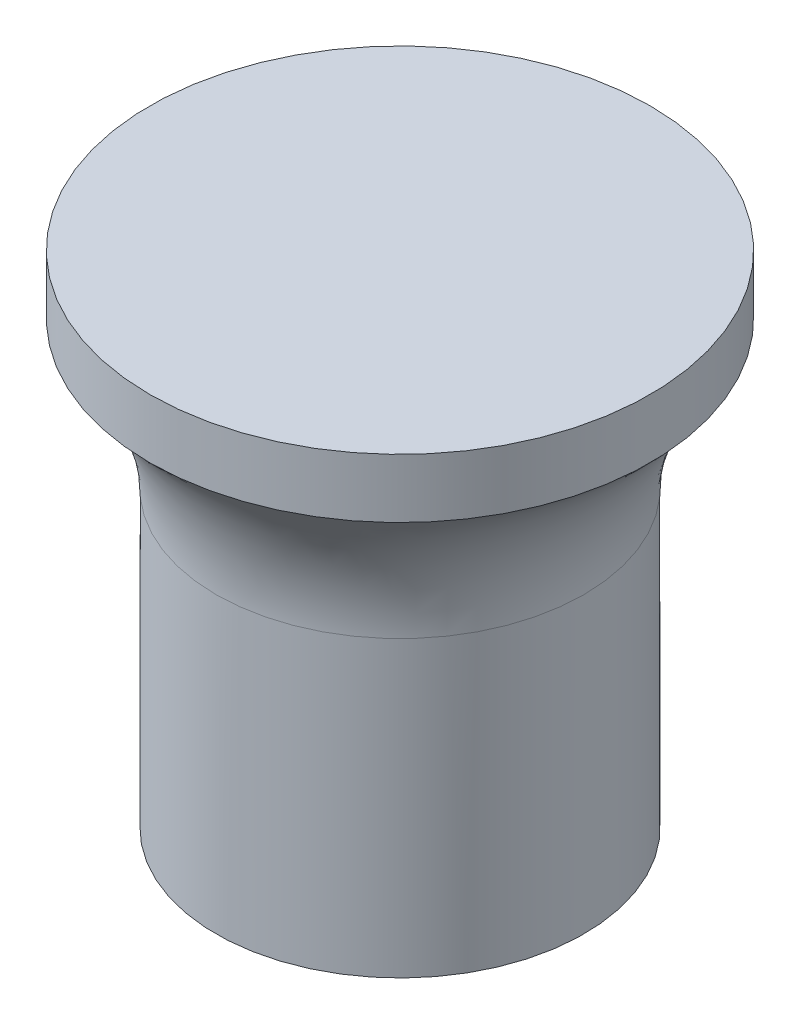
ISO-10303-21;
HEADER;
FILE_DESCRIPTION(('STEP AP214'),'2;1');
FILE_NAME('part.step','',(''),(''),'','','');
FILE_SCHEMA(('AUTOMOTIVE_DESIGN { 1 0 10303 214 1 1 1 1 }'));
ENDSEC;
DATA;
#1=APPLICATION_CONTEXT('core data for automotive mechanical design processes');
#2=APPLICATION_PROTOCOL_DEFINITION('international standard','automotive_design',2000,#1);
#3=PRODUCT_CONTEXT('',#1,'mechanical');
#4=PRODUCT('Part','Part','',(#3));
#5=PRODUCT_RELATED_PRODUCT_CATEGORY('part','',(#4));
#6=PRODUCT_DEFINITION_FORMATION('','',#4);
#7=PRODUCT_DEFINITION_CONTEXT('part definition',#1,'design');
#8=PRODUCT_DEFINITION('design','',#6,#7);
#9=PRODUCT_DEFINITION_SHAPE('','',#8);
#10=(LENGTH_UNIT() NAMED_UNIT(*) SI_UNIT(.MILLI.,.METRE.));
#11=(NAMED_UNIT(*) PLANE_ANGLE_UNIT() SI_UNIT($,.RADIAN.));
#12=(NAMED_UNIT(*) SI_UNIT($,.STERADIAN.) SOLID_ANGLE_UNIT());
#13=UNCERTAINTY_MEASURE_WITH_UNIT(LENGTH_MEASURE(1.E-05),#10,'distance_accuracy_value','');
#14=(GEOMETRIC_REPRESENTATION_CONTEXT(3) GLOBAL_UNCERTAINTY_ASSIGNED_CONTEXT((#13)) GLOBAL_UNIT_ASSIGNED_CONTEXT((#10,
#11,#12)) REPRESENTATION_CONTEXT('',''));
#15=CARTESIAN_POINT('',(0.,0.,0.));
#16=DIRECTION('',(0.,0.,1.));
#17=DIRECTION('',(1.,0.,0.));
#18=AXIS2_PLACEMENT_3D('',#15,#16,#17);
#19=CARTESIAN_POINT('',(0.,22.4,0.));
#20=DIRECTION('',(0.,1.,0.));
#21=DIRECTION('',(0.,0.,1.));
#22=AXIS2_PLACEMENT_3D('',#19,#20,#21);
#23=PLANE('',#22);
#24=CARTESIAN_POINT('',(0.,22.4,0.));
#25=DIRECTION('',(0.,1.,0.));
#26=DIRECTION('',(0.,0.,1.));
#27=AXIS2_PLACEMENT_3D('',#24,#25,#26);
#28=CIRCLE('',#27,6.34);
#29=CARTESIAN_POINT('',(0.,22.4,6.34));
#30=VERTEX_POINT('',#29);
#31=EDGE_CURVE('E48',#30,#30,#28,.F.);
#32=ORIENTED_EDGE('',*,*,#31,.T.);
#33=EDGE_LOOP('',(#32));
#34=FACE_BOUND('',#33,.T.);
#35=ADVANCED_FACE('F33',(#34),#23,.F.);
#36=CARTESIAN_POINT('',(0.,43.3322279708908,0.));
#37=DIRECTION('',(0.,-1.,0.));
#38=DIRECTION('',(0.,0.,-1.));
#39=AXIS2_PLACEMENT_3D('',#36,#37,#38);
#40=CYLINDRICAL_SURFACE('',#39,6.34);
#41=CARTESIAN_POINT('',(0.,7.14142842854285,0.));
#42=DIRECTION('',(0.,-1.,0.));
#43=DIRECTION('',(0.,0.,-1.));
#44=AXIS2_PLACEMENT_3D('',#41,#42,#43);
#45=CIRCLE('',#44,6.34);
#46=CARTESIAN_POINT('',(0.,7.14142842854285,-6.34));
#47=VERTEX_POINT('',#46);
#48=EDGE_CURVE('E40',#47,#47,#45,.T.);
#49=ORIENTED_EDGE('',*,*,#48,.T.);
#50=EDGE_LOOP('',(#49));
#51=FACE_BOUND('',#50,.T.);
#52=ORIENTED_EDGE('',*,*,#31,.F.);
#53=EDGE_LOOP('',(#52));
#54=FACE_BOUND('',#53,.T.);
#55=ADVANCED_FACE('F66',(#51,#54),#40,.F.);
#56=CARTESIAN_POINT('',(0.,61.3210244842766,0.));
#57=DIRECTION('',(0.,-1.,0.));
#58=DIRECTION('',(0.,0.,-1.));
#59=AXIS2_PLACEMENT_3D('',#56,#57,#58);
#60=CYLINDRICAL_SURFACE('',#59,9.34);
#61=CARTESIAN_POINT('',(0.,14.9226742748493,0.));
#62=DIRECTION('',(0.,1.,0.));
#63=DIRECTION('',(0.,0.,1.));
#64=AXIS2_PLACEMENT_3D('',#61,#62,#63);
#65=CIRCLE('',#64,9.34);
#66=CARTESIAN_POINT('',(0.,14.9226742748493,9.34));
#67=VERTEX_POINT('',#66);
#68=EDGE_CURVE('E11',#67,#67,#65,.F.);
#69=ORIENTED_EDGE('',*,*,#68,.T.);
#70=EDGE_LOOP('',(#69));
#71=FACE_BOUND('',#70,.T.);
#72=CARTESIAN_POINT('',(0.,0.,0.));
#73=DIRECTION('',(0.,-1.,0.));
#74=DIRECTION('',(0.,0.,-1.));
#75=AXIS2_PLACEMENT_3D('',#72,#73,#74);
#76=CIRCLE('',#75,9.34);
#77=CARTESIAN_POINT('',(0.,0.,-9.34));
#78=VERTEX_POINT('',#77);
#79=EDGE_CURVE('E53',#78,#78,#76,.T.);
#80=ORIENTED_EDGE('',*,*,#79,.F.);
#81=EDGE_LOOP('',(#80));
#82=FACE_BOUND('',#81,.T.);
#83=ADVANCED_FACE('F63',(#71,#82),#60,.T.);
#84=CARTESIAN_POINT('',(0.,25.4,0.));
#85=DIRECTION('',(0.,1.,0.));
#86=DIRECTION('',(0.,0.,1.));
#87=AXIS2_PLACEMENT_3D('',#84,#85,#86);
#88=PLANE('',#87);
#89=CARTESIAN_POINT('',(0.,25.4,0.));
#90=DIRECTION('',(0.,1.,0.));
#91=DIRECTION('',(0.,0.,1.));
#92=AXIS2_PLACEMENT_3D('',#89,#90,#91);
#93=CIRCLE('',#92,12.7);
#94=CARTESIAN_POINT('',(0.,25.4,12.7));
#95=VERTEX_POINT('',#94);
#96=EDGE_CURVE('E44',#95,#95,#93,.T.);
#97=ORIENTED_EDGE('',*,*,#96,.T.);
#98=EDGE_LOOP('',(#97));
#99=FACE_BOUND('',#98,.T.);
#100=ADVANCED_FACE('F65',(#99),#88,.T.);
#101=CARTESIAN_POINT('',(0.,25.4,0.));
#102=DIRECTION('',(0.,-1.,0.));
#103=DIRECTION('',(0.,0.,-1.));
#104=AXIS2_PLACEMENT_3D('',#101,#102,#103);
#105=CYLINDRICAL_SURFACE('',#104,12.7);
#106=CARTESIAN_POINT('',(0.,22.4,0.));
#107=DIRECTION('',(0.,1.,0.));
#108=DIRECTION('',(0.,0.,1.));
#109=AXIS2_PLACEMENT_3D('',#106,#107,#108);
#110=CIRCLE('',#109,12.7);
#111=CARTESIAN_POINT('',(0.,22.4,12.7));
#112=VERTEX_POINT('',#111);
#113=EDGE_CURVE('E54',#112,#112,#110,.F.);
#114=ORIENTED_EDGE('',*,*,#113,.F.);
#115=EDGE_LOOP('',(#114));
#116=FACE_BOUND('',#115,.T.);
#117=ORIENTED_EDGE('',*,*,#96,.F.);
#118=EDGE_LOOP('',(#117));
#119=FACE_BOUND('',#118,.T.);
#120=ADVANCED_FACE('F72',(#116,#119),#105,.T.);
#121=CARTESIAN_POINT('',(0.,7.14142842854285,0.));
#122=DIRECTION('',(0.,-1.,0.));
#123=DIRECTION('',(0.,0.,-1.));
#124=AXIS2_PLACEMENT_3D('',#121,#122,#123);
#125=TOROIDAL_SURFACE('',#124,16.34,10.);
#126=ORIENTED_EDGE('',*,*,#79,.T.);
#127=EDGE_LOOP('',(#126));
#128=FACE_BOUND('',#127,.T.);
#129=ORIENTED_EDGE('',*,*,#48,.F.);
#130=EDGE_LOOP('',(#129));
#131=FACE_BOUND('',#130,.T.);
#132=ADVANCED_FACE('F60',(#128,#131),#125,.T.);
#133=CARTESIAN_POINT('',(0.,14.9226742748493,0.));
#134=DIRECTION('',(0.,1.,0.));
#135=DIRECTION('',(0.,0.,1.));
#136=AXIS2_PLACEMENT_3D('',#133,#134,#135);
#137=TOROIDAL_SURFACE('',#136,19.34,10.);
#138=ORIENTED_EDGE('',*,*,#113,.T.);
#139=EDGE_LOOP('',(#138));
#140=FACE_BOUND('',#139,.T.);
#141=ORIENTED_EDGE('',*,*,#68,.F.);
#142=EDGE_LOOP('',(#141));
#143=FACE_BOUND('',#142,.T.);
#144=ADVANCED_FACE('F35',(#140,#143),#137,.F.);
#145=CLOSED_SHELL('',(#35,#55,#83,#100,#120,#132,#144));
#146=MANIFOLD_SOLID_BREP('B2',#145);
#147=ADVANCED_BREP_SHAPE_REPRESENTATION('',(#18,#146),#14);
#148=SHAPE_DEFINITION_REPRESENTATION(#9,#147);
ENDSEC;
END-ISO-10303-21;
